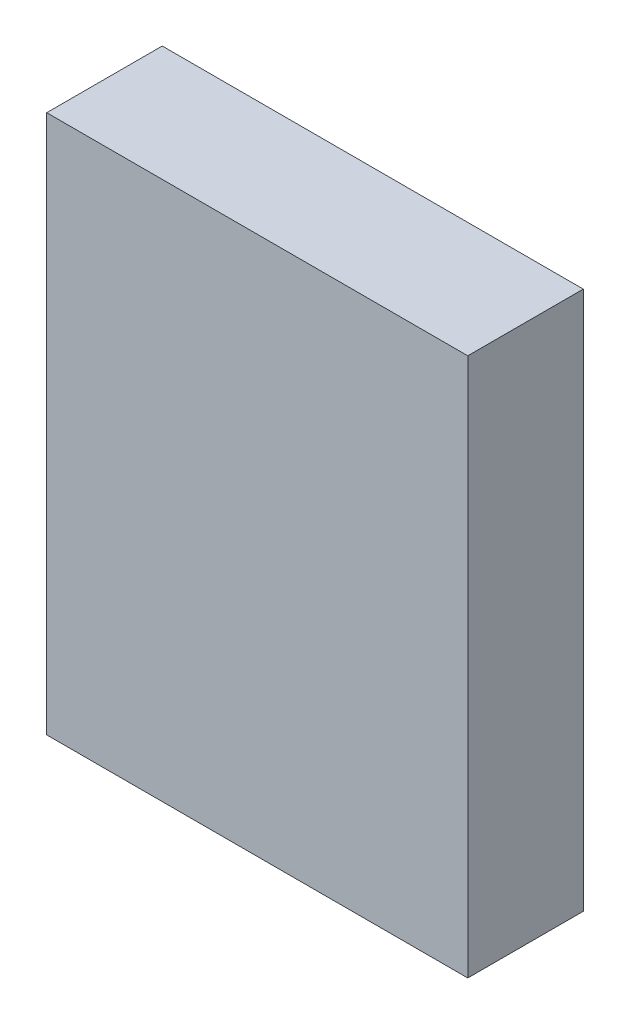
ISO-10303-21;
HEADER;
FILE_DESCRIPTION(('STEP AP214'),'2;1');
FILE_NAME('part.step','',(''),(''),'','','');
FILE_SCHEMA(('AUTOMOTIVE_DESIGN { 1 0 10303 214 1 1 1 1 }'));
ENDSEC;
DATA;
#1=APPLICATION_CONTEXT('core data for automotive mechanical design processes');
#2=APPLICATION_PROTOCOL_DEFINITION('international standard','automotive_design',2000,#1);
#3=PRODUCT_CONTEXT('',#1,'mechanical');
#4=PRODUCT('Part','Part','',(#3));
#5=PRODUCT_RELATED_PRODUCT_CATEGORY('part','',(#4));
#6=PRODUCT_DEFINITION_FORMATION('','',#4);
#7=PRODUCT_DEFINITION_CONTEXT('part definition',#1,'design');
#8=PRODUCT_DEFINITION('design','',#6,#7);
#9=PRODUCT_DEFINITION_SHAPE('','',#8);
#10=(LENGTH_UNIT() NAMED_UNIT(*) SI_UNIT(.MILLI.,.METRE.));
#11=(NAMED_UNIT(*) PLANE_ANGLE_UNIT() SI_UNIT($,.RADIAN.));
#12=(NAMED_UNIT(*) SI_UNIT($,.STERADIAN.) SOLID_ANGLE_UNIT());
#13=UNCERTAINTY_MEASURE_WITH_UNIT(LENGTH_MEASURE(1.E-05),#10,'distance_accuracy_value','');
#14=(GEOMETRIC_REPRESENTATION_CONTEXT(3) GLOBAL_UNCERTAINTY_ASSIGNED_CONTEXT((#13)) GLOBAL_UNIT_ASSIGNED_CONTEXT((#10,
#11,#12)) REPRESENTATION_CONTEXT('',''));
#15=CARTESIAN_POINT('',(0.,0.,0.));
#16=DIRECTION('',(0.,0.,1.));
#17=DIRECTION('',(1.,0.,0.));
#18=AXIS2_PLACEMENT_3D('',#15,#16,#17);
#19=CARTESIAN_POINT('',(206.525,23.94125113365,-36.03816558701));
#20=DIRECTION('',(0.,0.,1.));
#21=DIRECTION('',(1.,0.,0.));
#22=AXIS2_PLACEMENT_3D('',#19,#20,#21);
#23=PLANE('',#22);
#24=DIRECTION('',(1.,0.,0.));
#25=VECTOR('',#24,1.);
#26=CARTESIAN_POINT('',(206.525,21.41373526258,-36.03816558701));
#27=LINE('',#26,#25);
#28=CARTESIAN_POINT('',(204.55,21.41373526258,-36.03816558701));
#29=VERTEX_POINT('',#28);
#30=CARTESIAN_POINT('',(208.5,21.41373526258,-36.03816558701));
#31=VERTEX_POINT('',#30);
#32=EDGE_CURVE('E20',#29,#31,#27,.T.);
#33=ORIENTED_EDGE('',*,*,#32,.T.);
#34=DIRECTION('',(0.,1.,0.));
#35=VECTOR('',#34,1.);
#36=CARTESIAN_POINT('',(208.5,-54.,-36.03816558701));
#37=LINE('',#36,#35);
#38=CARTESIAN_POINT('',(208.5,26.4687670047103,-36.03816558701));
#39=VERTEX_POINT('',#38);
#40=EDGE_CURVE('E80',#39,#31,#37,.F.);
#41=ORIENTED_EDGE('',*,*,#40,.F.);
#42=DIRECTION('',(-1.,-2.77021724828E-13,0.));
#43=VECTOR('',#42,1.);
#44=CARTESIAN_POINT('',(206.525,26.46876700471,-36.03816558701));
#45=LINE('',#44,#43);
#46=CARTESIAN_POINT('',(204.55,26.4687670047099,-36.03816558701));
#47=VERTEX_POINT('',#46);
#48=EDGE_CURVE('E61',#47,#39,#45,.F.);
#49=ORIENTED_EDGE('',*,*,#48,.F.);
#50=DIRECTION('',(0.,1.,0.));
#51=VECTOR('',#50,1.);
#52=CARTESIAN_POINT('',(204.55,-54.,-36.03816558701));
#53=LINE('',#52,#51);
#54=EDGE_CURVE('E55',#47,#29,#53,.F.);
#55=ORIENTED_EDGE('',*,*,#54,.T.);
#56=EDGE_LOOP('',(#33,#41,#49,#55));
#57=FACE_BOUND('',#56,.T.);
#58=ADVANCED_FACE('F17',(#57),#23,.T.);
#59=CARTESIAN_POINT('',(206.525,21.41373526258,-36.58));
#60=DIRECTION('',(0.,1.,0.));
#61=DIRECTION('',(0.,0.,1.));
#62=AXIS2_PLACEMENT_3D('',#59,#60,#61);
#63=PLANE('',#62);
#64=DIRECTION('',(0.,0.,-1.));
#65=VECTOR('',#64,1.);
#66=CARTESIAN_POINT('',(204.55,21.41373526258,101.5));
#67=LINE('',#66,#65);
#68=CARTESIAN_POINT('',(204.55,21.41373526258,-37.12183441299));
#69=VERTEX_POINT('',#68);
#70=EDGE_CURVE('E63',#29,#69,#67,.T.);
#71=ORIENTED_EDGE('',*,*,#70,.T.);
#72=DIRECTION('',(-1.,0.,0.));
#73=VECTOR('',#72,1.);
#74=CARTESIAN_POINT('',(206.525,21.41373526258,-37.12183441299));
#75=LINE('',#74,#73);
#76=CARTESIAN_POINT('',(208.5,21.41373526258,-37.12183441299));
#77=VERTEX_POINT('',#76);
#78=EDGE_CURVE('E83',#77,#69,#75,.T.);
#79=ORIENTED_EDGE('',*,*,#78,.F.);
#80=DIRECTION('',(0.,0.,-1.));
#81=VECTOR('',#80,1.);
#82=CARTESIAN_POINT('',(208.5,21.41373526258,101.5));
#83=LINE('',#82,#81);
#84=EDGE_CURVE('E68',#31,#77,#83,.T.);
#85=ORIENTED_EDGE('',*,*,#84,.F.);
#86=ORIENTED_EDGE('',*,*,#32,.F.);
#87=EDGE_LOOP('',(#71,#79,#85,#86));
#88=FACE_BOUND('',#87,.T.);
#89=ADVANCED_FACE('F65',(#88),#63,.F.);
#90=CARTESIAN_POINT('',(204.55,-54.,101.5));
#91=DIRECTION('',(1.,0.,0.));
#92=DIRECTION('',(0.,0.,-1.));
#93=AXIS2_PLACEMENT_3D('',#90,#91,#92);
#94=PLANE('',#93);
#95=ORIENTED_EDGE('',*,*,#54,.F.);
#96=DIRECTION('',(0.,0.,1.));
#97=VECTOR('',#96,1.);
#98=CARTESIAN_POINT('',(204.55,26.4687670047095,-36.58));
#99=LINE('',#98,#97);
#100=CARTESIAN_POINT('',(204.55,26.4687670047099,-37.12183441299));
#101=VERTEX_POINT('',#100);
#102=EDGE_CURVE('E74',#101,#47,#99,.T.);
#103=ORIENTED_EDGE('',*,*,#102,.F.);
#104=DIRECTION('',(0.,1.,0.));
#105=VECTOR('',#104,1.);
#106=CARTESIAN_POINT('',(204.55,23.94125113365,-37.12183441299));
#107=LINE('',#106,#105);
#108=EDGE_CURVE('E72',#69,#101,#107,.T.);
#109=ORIENTED_EDGE('',*,*,#108,.F.);
#110=ORIENTED_EDGE('',*,*,#70,.F.);
#111=EDGE_LOOP('',(#95,#103,#109,#110));
#112=FACE_BOUND('',#111,.T.);
#113=ADVANCED_FACE('F70',(#112),#94,.F.);
#114=CARTESIAN_POINT('',(206.525,26.46876700471,-36.58));
#115=DIRECTION('',(-2.77021724828E-13,1.,0.));
#116=DIRECTION('',(-1.,-2.77021724828E-13,0.));
#117=AXIS2_PLACEMENT_3D('',#114,#115,#116);
#118=PLANE('',#117);
#119=ORIENTED_EDGE('',*,*,#48,.T.);
#120=DIRECTION('',(0.,0.,-1.));
#121=VECTOR('',#120,1.);
#122=CARTESIAN_POINT('',(208.5,26.46876700471,101.5));
#123=LINE('',#122,#121);
#124=CARTESIAN_POINT('',(208.5,26.4687670047103,-37.12183441299));
#125=VERTEX_POINT('',#124);
#126=EDGE_CURVE('E35',#125,#39,#123,.F.);
#127=ORIENTED_EDGE('',*,*,#126,.F.);
#128=DIRECTION('',(-1.,0.,0.));
#129=VECTOR('',#128,1.);
#130=CARTESIAN_POINT('',(206.525,26.46876700471,-37.12183441299));
#131=LINE('',#130,#129);
#132=EDGE_CURVE('E26',#101,#125,#131,.F.);
#133=ORIENTED_EDGE('',*,*,#132,.F.);
#134=ORIENTED_EDGE('',*,*,#102,.T.);
#135=EDGE_LOOP('',(#119,#127,#133,#134));
#136=FACE_BOUND('',#135,.T.);
#137=ADVANCED_FACE('F89',(#136),#118,.T.);
#138=CARTESIAN_POINT('',(208.5,-54.,101.5));
#139=DIRECTION('',(1.,0.,0.));
#140=DIRECTION('',(0.,0.,-1.));
#141=AXIS2_PLACEMENT_3D('',#138,#139,#140);
#142=PLANE('',#141);
#143=ORIENTED_EDGE('',*,*,#84,.T.);
#144=DIRECTION('',(0.,1.,0.));
#145=VECTOR('',#144,1.);
#146=CARTESIAN_POINT('',(208.5,23.94125113365,-37.12183441299));
#147=LINE('',#146,#145);
#148=EDGE_CURVE('E11',#125,#77,#147,.F.);
#149=ORIENTED_EDGE('',*,*,#148,.F.);
#150=ORIENTED_EDGE('',*,*,#126,.T.);
#151=ORIENTED_EDGE('',*,*,#40,.T.);
#152=EDGE_LOOP('',(#143,#149,#150,#151));
#153=FACE_BOUND('',#152,.T.);
#154=ADVANCED_FACE('F91',(#153),#142,.T.);
#155=CARTESIAN_POINT('',(206.525,23.94125113365,-37.12183441299));
#156=DIRECTION('',(0.,0.,-1.));
#157=DIRECTION('',(-1.,0.,0.));
#158=AXIS2_PLACEMENT_3D('',#155,#156,#157);
#159=PLANE('',#158);
#160=ORIENTED_EDGE('',*,*,#132,.T.);
#161=ORIENTED_EDGE('',*,*,#148,.T.);
#162=ORIENTED_EDGE('',*,*,#78,.T.);
#163=ORIENTED_EDGE('',*,*,#108,.T.);
#164=EDGE_LOOP('',(#160,#161,#162,#163));
#165=FACE_BOUND('',#164,.T.);
#166=ADVANCED_FACE('F88',(#165),#159,.T.);
#167=CLOSED_SHELL('',(#58,#89,#113,#137,#154,#166));
#168=MANIFOLD_SOLID_BREP('B1',#167);
#169=ADVANCED_BREP_SHAPE_REPRESENTATION('',(#18,#168),#14);
#170=SHAPE_DEFINITION_REPRESENTATION(#9,#169);
ENDSEC;
END-ISO-10303-21;
